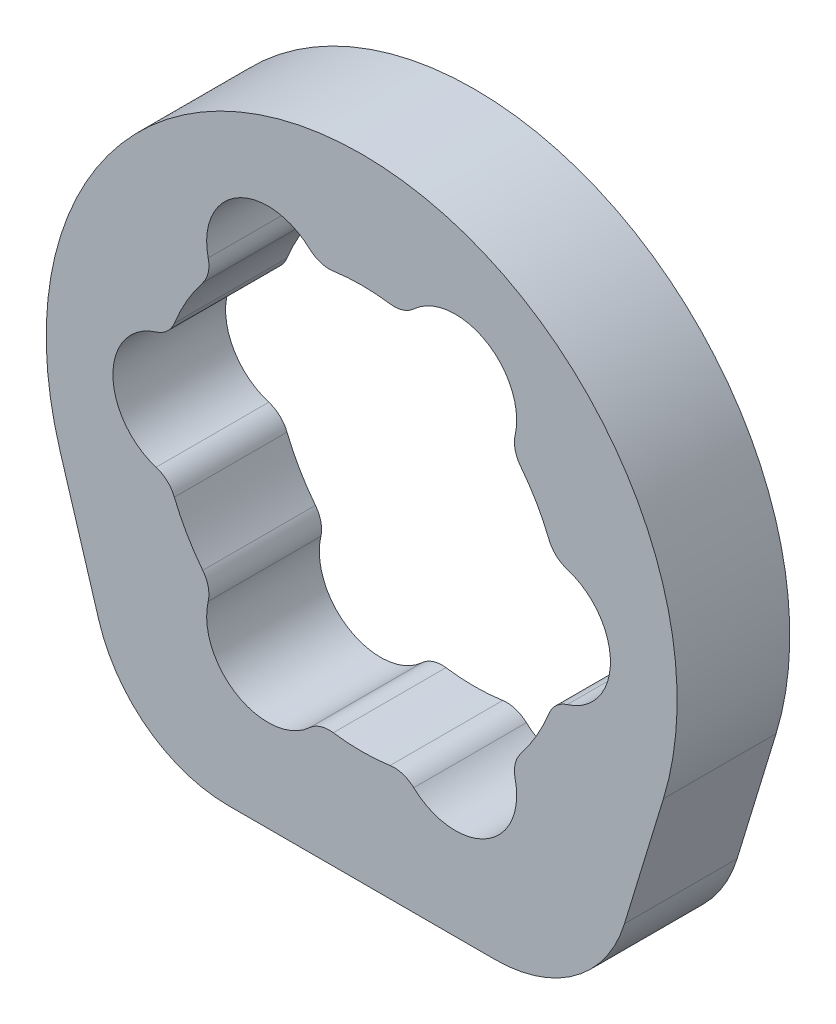
ISO-10303-21;
HEADER;
FILE_DESCRIPTION(('STEP AP214'),'2;1');
FILE_NAME('part.step','',(''),(''),'','','');
FILE_SCHEMA(('AUTOMOTIVE_DESIGN { 1 0 10303 214 1 1 1 1 }'));
ENDSEC;
DATA;
#1=APPLICATION_CONTEXT('core data for automotive mechanical design processes');
#2=APPLICATION_PROTOCOL_DEFINITION('international standard','automotive_design',2000,#1);
#3=PRODUCT_CONTEXT('',#1,'mechanical');
#4=PRODUCT('Part','Part','',(#3));
#5=PRODUCT_RELATED_PRODUCT_CATEGORY('part','',(#4));
#6=PRODUCT_DEFINITION_FORMATION('','',#4);
#7=PRODUCT_DEFINITION_CONTEXT('part definition',#1,'design');
#8=PRODUCT_DEFINITION('design','',#6,#7);
#9=PRODUCT_DEFINITION_SHAPE('','',#8);
#10=(LENGTH_UNIT() NAMED_UNIT(*) SI_UNIT(.MILLI.,.METRE.));
#11=(NAMED_UNIT(*) PLANE_ANGLE_UNIT() SI_UNIT($,.RADIAN.));
#12=(NAMED_UNIT(*) SI_UNIT($,.STERADIAN.) SOLID_ANGLE_UNIT());
#13=UNCERTAINTY_MEASURE_WITH_UNIT(LENGTH_MEASURE(1.E-05),#10,'distance_accuracy_value','');
#14=(GEOMETRIC_REPRESENTATION_CONTEXT(3) GLOBAL_UNCERTAINTY_ASSIGNED_CONTEXT((#13)) GLOBAL_UNIT_ASSIGNED_CONTEXT((#10,
#11,#12)) REPRESENTATION_CONTEXT('',''));
#15=CARTESIAN_POINT('',(0.,0.,0.));
#16=DIRECTION('',(0.,0.,1.));
#17=DIRECTION('',(1.,0.,0.));
#18=AXIS2_PLACEMENT_3D('',#15,#16,#17);
#19=CARTESIAN_POINT('',(0.,0.,3.96875));
#20=DIRECTION('',(0.,0.,-1.));
#21=DIRECTION('',(-1.,0.,0.));
#22=AXIS2_PLACEMENT_3D('',#19,#20,#21);
#23=CYLINDRICAL_SURFACE('',#22,22.225);
#24=CARTESIAN_POINT('',(0.,0.,-3.96875));
#25=DIRECTION('',(0.,0.,1.));
#26=DIRECTION('',(1.,0.,0.));
#27=AXIS2_PLACEMENT_3D('',#24,#25,#26);
#28=CIRCLE('',#27,22.225);
#29=CARTESIAN_POINT('',(21.2586575246007,-6.48229166666667,-3.96875));
#30=VERTEX_POINT('',#29);
#31=CARTESIAN_POINT('',(-21.2586575246007,-6.48229166666667,-3.96875));
#32=VERTEX_POINT('',#31);
#33=EDGE_CURVE('E254',#30,#32,#28,.T.);
#34=ORIENTED_EDGE('',*,*,#33,.T.);
#35=DIRECTION('',(0.,0.,-1.));
#36=VECTOR('',#35,1.);
#37=CARTESIAN_POINT('',(-21.2586575246007,-6.48229166666667,3.96875));
#38=LINE('',#37,#36);
#39=CARTESIAN_POINT('',(-21.2586575246007,-6.48229166666667,3.96875));
#40=VERTEX_POINT('',#39);
#41=EDGE_CURVE('E241',#40,#32,#38,.T.);
#42=ORIENTED_EDGE('',*,*,#41,.F.);
#43=CARTESIAN_POINT('',(0.,0.,3.96875));
#44=DIRECTION('',(0.,0.,1.));
#45=DIRECTION('',(1.,0.,0.));
#46=AXIS2_PLACEMENT_3D('',#43,#44,#45);
#47=CIRCLE('',#46,22.225);
#48=CARTESIAN_POINT('',(21.2586575246007,-6.48229166666667,3.96875));
#49=VERTEX_POINT('',#48);
#50=EDGE_CURVE('E245',#49,#40,#47,.T.);
#51=ORIENTED_EDGE('',*,*,#50,.F.);
#52=DIRECTION('',(0.,0.,-1.));
#53=VECTOR('',#52,1.);
#54=CARTESIAN_POINT('',(21.2586575246007,-6.48229166666667,3.96875));
#55=LINE('',#54,#53);
#56=EDGE_CURVE('E256',#49,#30,#55,.T.);
#57=ORIENTED_EDGE('',*,*,#56,.T.);
#58=EDGE_LOOP('',(#34,#42,#51,#57));
#59=FACE_BOUND('',#58,.T.);
#60=ADVANCED_FACE('F39',(#59),#23,.T.);
#61=CARTESIAN_POINT('',(-21.2586575246007,-6.48229166666666,3.96875));
#62=DIRECTION('',(0.956520023604083,0.291666666666667,0.));
#63=DIRECTION('',(-0.291666666666667,0.956520023604083,0.));
#64=AXIS2_PLACEMENT_3D('',#61,#62,#63);
#65=PLANE('',#64);
#66=DIRECTION('',(0.291666666666667,-0.956520023604083,0.));
#67=VECTOR('',#66,1.);
#68=CARTESIAN_POINT('',(-21.2586575246007,-6.48229166666666,-3.96875));
#69=LINE('',#68,#67);
#70=CARTESIAN_POINT('',(-18.5156049407813,-15.478125,-3.96875));
#71=VERTEX_POINT('',#70);
#72=EDGE_CURVE('E390',#32,#71,#69,.T.);
#73=ORIENTED_EDGE('',*,*,#72,.T.);
#74=DIRECTION('',(0.,0.,-1.));
#75=VECTOR('',#74,1.);
#76=CARTESIAN_POINT('',(-18.5156049407813,-15.478125,3.96875));
#77=LINE('',#76,#75);
#78=CARTESIAN_POINT('',(-18.5156049407813,-15.478125,3.96875));
#79=VERTEX_POINT('',#78);
#80=EDGE_CURVE('E62',#71,#79,#77,.F.);
#81=ORIENTED_EDGE('',*,*,#80,.T.);
#82=DIRECTION('',(0.291666666666667,-0.956520023604083,0.));
#83=VECTOR('',#82,1.);
#84=CARTESIAN_POINT('',(-21.2586575246007,-6.48229166666666,3.96875));
#85=LINE('',#84,#83);
#86=EDGE_CURVE('E237',#40,#79,#85,.T.);
#87=ORIENTED_EDGE('',*,*,#86,.F.);
#88=ORIENTED_EDGE('',*,*,#41,.T.);
#89=EDGE_LOOP('',(#73,#81,#87,#88));
#90=FACE_BOUND('',#89,.T.);
#91=ADVANCED_FACE('F239',(#90),#65,.F.);
#92=CARTESIAN_POINT('',(0.,-22.225,3.96875));
#93=DIRECTION('',(0.,1.,0.));
#94=DIRECTION('',(0.,0.,1.));
#95=AXIS2_PLACEMENT_3D('',#92,#93,#94);
#96=PLANE('',#95);
#97=DIRECTION('',(1.,0.,0.));
#98=VECTOR('',#97,1.);
#99=CARTESIAN_POINT('',(0.,-22.225,3.96875));
#100=LINE('',#99,#98);
#101=CARTESIAN_POINT('',(-9.4047517159524,-22.225,3.96875));
#102=VERTEX_POINT('',#101);
#103=CARTESIAN_POINT('',(9.4047517159524,-22.225,3.96875));
#104=VERTEX_POINT('',#103);
#105=EDGE_CURVE('E244',#102,#104,#100,.T.);
#106=ORIENTED_EDGE('',*,*,#105,.F.);
#107=DIRECTION('',(0.,0.,-1.));
#108=VECTOR('',#107,1.);
#109=CARTESIAN_POINT('',(-9.4047517159524,-22.225,3.96875));
#110=LINE('',#109,#108);
#111=CARTESIAN_POINT('',(-9.4047517159524,-22.225,-3.96875));
#112=VERTEX_POINT('',#111);
#113=EDGE_CURVE('E370',#102,#112,#110,.T.);
#114=ORIENTED_EDGE('',*,*,#113,.T.);
#115=DIRECTION('',(1.,0.,0.));
#116=VECTOR('',#115,1.);
#117=CARTESIAN_POINT('',(0.,-22.225,-3.96875));
#118=LINE('',#117,#116);
#119=CARTESIAN_POINT('',(9.4047517159524,-22.225,-3.96875));
#120=VERTEX_POINT('',#119);
#121=EDGE_CURVE('E391',#112,#120,#118,.T.);
#122=ORIENTED_EDGE('',*,*,#121,.T.);
#123=DIRECTION('',(0.,0.,-1.));
#124=VECTOR('',#123,1.);
#125=CARTESIAN_POINT('',(9.4047517159524,-22.225,3.96875));
#126=LINE('',#125,#124);
#127=EDGE_CURVE('E368',#120,#104,#126,.F.);
#128=ORIENTED_EDGE('',*,*,#127,.T.);
#129=EDGE_LOOP('',(#106,#114,#122,#128));
#130=FACE_BOUND('',#129,.T.);
#131=ADVANCED_FACE('F382',(#130),#96,.F.);
#132=CARTESIAN_POINT('',(-13.208,0.,3.96875));
#133=DIRECTION('',(0.,0.,-1.));
#134=DIRECTION('',(-1.,0.,0.));
#135=AXIS2_PLACEMENT_3D('',#132,#133,#134);
#136=CYLINDRICAL_SURFACE('',#135,4.318);
#137=CARTESIAN_POINT('',(-13.208,0.,3.96875));
#138=DIRECTION('',(0.,0.,1.));
#139=DIRECTION('',(1.,0.,0.));
#140=AXIS2_PLACEMENT_3D('',#137,#138,#139);
#141=CIRCLE('',#140,4.318);
#142=CARTESIAN_POINT('',(-14.48181,4.12583713734557,3.96875));
#143=VERTEX_POINT('',#142);
#144=CARTESIAN_POINT('',(-14.48181,-4.12583713734559,3.96875));
#145=VERTEX_POINT('',#144);
#146=EDGE_CURVE('E399',#143,#145,#141,.T.);
#147=ORIENTED_EDGE('',*,*,#146,.T.);
#148=DIRECTION('',(0.,0.,-1.));
#149=VECTOR('',#148,1.);
#150=CARTESIAN_POINT('',(-14.48181,-4.12583713734559,3.96875));
#151=LINE('',#150,#149);
#152=CARTESIAN_POINT('',(-14.48181,-4.12583713734559,-3.96875));
#153=VERTEX_POINT('',#152);
#154=EDGE_CURVE('E258',#145,#153,#151,.T.);
#155=ORIENTED_EDGE('',*,*,#154,.T.);
#156=CARTESIAN_POINT('',(-13.208,0.,-3.96875));
#157=DIRECTION('',(0.,0.,1.));
#158=DIRECTION('',(1.,0.,0.));
#159=AXIS2_PLACEMENT_3D('',#156,#157,#158);
#160=CIRCLE('',#159,4.318);
#161=CARTESIAN_POINT('',(-14.48181,4.12583713734557,-3.96875));
#162=VERTEX_POINT('',#161);
#163=EDGE_CURVE('E431',#162,#153,#160,.T.);
#164=ORIENTED_EDGE('',*,*,#163,.F.);
#165=DIRECTION('',(0.,0.,-1.));
#166=VECTOR('',#165,1.);
#167=CARTESIAN_POINT('',(-14.48181,4.12583713734557,3.96875));
#168=LINE('',#167,#166);
#169=EDGE_CURVE('E255',#162,#143,#168,.F.);
#170=ORIENTED_EDGE('',*,*,#169,.T.);
#171=EDGE_LOOP('',(#147,#155,#164,#170));
#172=FACE_BOUND('',#171,.T.);
#173=ADVANCED_FACE('F551',(#172),#136,.F.);
#174=CARTESIAN_POINT('',(0.,0.,3.96875));
#175=DIRECTION('',(0.,0.,-1.));
#176=DIRECTION('',(-1.,0.,0.));
#177=AXIS2_PLACEMENT_3D('',#174,#175,#176);
#178=CYLINDRICAL_SURFACE('',#177,14.224);
#179=CARTESIAN_POINT('',(0.,0.,-3.96875));
#180=DIRECTION('',(0.,0.,1.));
#181=DIRECTION('',(1.,0.,0.));
#182=AXIS2_PLACEMENT_3D('',#179,#180,#181);
#183=CIRCLE('',#182,14.224);
#184=CARTESIAN_POINT('',(-11.195759817965,8.77366161294357,-3.96875));
#185=VERTEX_POINT('',#184);
#186=CARTESIAN_POINT('',(-13.19609375,5.30898161055497,-3.96875));
#187=VERTEX_POINT('',#186);
#188=EDGE_CURVE('E434',#185,#187,#183,.T.);
#189=ORIENTED_EDGE('',*,*,#188,.F.);
#190=DIRECTION('',(0.,0.,-1.));
#191=VECTOR('',#190,1.);
#192=CARTESIAN_POINT('',(-11.195759817965,8.77366161294357,3.96875));
#193=LINE('',#192,#191);
#194=CARTESIAN_POINT('',(-11.195759817965,8.77366161294357,3.96875));
#195=VERTEX_POINT('',#194);
#196=EDGE_CURVE('E366',#185,#195,#193,.F.);
#197=ORIENTED_EDGE('',*,*,#196,.T.);
#198=CARTESIAN_POINT('',(0.,0.,3.96875));
#199=DIRECTION('',(0.,0.,1.));
#200=DIRECTION('',(1.,0.,0.));
#201=AXIS2_PLACEMENT_3D('',#198,#199,#200);
#202=CIRCLE('',#201,14.224);
#203=CARTESIAN_POINT('',(-13.19609375,5.30898161055497,3.96875));
#204=VERTEX_POINT('',#203);
#205=EDGE_CURVE('E402',#195,#204,#202,.T.);
#206=ORIENTED_EDGE('',*,*,#205,.T.);
#207=DIRECTION('',(0.,0.,-1.));
#208=VECTOR('',#207,1.);
#209=CARTESIAN_POINT('',(-13.19609375,5.30898161055497,3.96875));
#210=LINE('',#209,#208);
#211=EDGE_CURVE('E363',#204,#187,#210,.T.);
#212=ORIENTED_EDGE('',*,*,#211,.T.);
#213=EDGE_LOOP('',(#189,#197,#206,#212));
#214=FACE_BOUND('',#213,.T.);
#215=ADVANCED_FACE('F534',(#214),#178,.F.);
#216=CARTESIAN_POINT('',(-6.604,11.4384635331849,3.96875));
#217=DIRECTION('',(0.,0.,-1.));
#218=DIRECTION('',(-1.,0.,0.));
#219=AXIS2_PLACEMENT_3D('',#216,#217,#218);
#220=CYLINDRICAL_SURFACE('',#219,4.318);
#221=CARTESIAN_POINT('',(-6.604,11.4384635331849,3.96875));
#222=DIRECTION('',(0.,0.,1.));
#223=DIRECTION('',(1.,0.,0.));
#224=AXIS2_PLACEMENT_3D('',#221,#222,#223);
#225=CIRCLE('',#224,4.318);
#226=CARTESIAN_POINT('',(-3.66782522718146,14.6045339214523,3.96875));
#227=VERTEX_POINT('',#226);
#228=CARTESIAN_POINT('',(-10.8139847728185,10.4786967841067,3.96875));
#229=VERTEX_POINT('',#228);
#230=EDGE_CURVE('E408',#227,#229,#225,.T.);
#231=ORIENTED_EDGE('',*,*,#230,.T.);
#232=DIRECTION('',(0.,0.,-1.));
#233=VECTOR('',#232,1.);
#234=CARTESIAN_POINT('',(-10.8139847728185,10.4786967841067,3.96875));
#235=LINE('',#234,#233);
#236=CARTESIAN_POINT('',(-10.8139847728185,10.4786967841067,-3.96875));
#237=VERTEX_POINT('',#236);
#238=EDGE_CURVE('E360',#229,#237,#235,.T.);
#239=ORIENTED_EDGE('',*,*,#238,.T.);
#240=CARTESIAN_POINT('',(-6.604,11.4384635331849,-3.96875));
#241=DIRECTION('',(0.,0.,1.));
#242=DIRECTION('',(1.,0.,0.));
#243=AXIS2_PLACEMENT_3D('',#240,#241,#242);
#244=CIRCLE('',#243,4.318);
#245=CARTESIAN_POINT('',(-3.66782522718146,14.6045339214523,-3.96875));
#246=VERTEX_POINT('',#245);
#247=EDGE_CURVE('E437',#246,#237,#244,.T.);
#248=ORIENTED_EDGE('',*,*,#247,.F.);
#249=DIRECTION('',(0.,0.,-1.));
#250=VECTOR('',#249,1.);
#251=CARTESIAN_POINT('',(-3.66782522718146,14.6045339214523,3.96875));
#252=LINE('',#251,#250);
#253=EDGE_CURVE('E358',#246,#227,#252,.F.);
#254=ORIENTED_EDGE('',*,*,#253,.T.);
#255=EDGE_LOOP('',(#231,#239,#248,#254));
#256=FACE_BOUND('',#255,.T.);
#257=ADVANCED_FACE('F547',(#256),#220,.F.);
#258=CARTESIAN_POINT('',(2.00033393203496,14.0826432234985,-3.96875));
#259=VERTEX_POINT('',#258);
#260=CARTESIAN_POINT('',(-2.00033393203496,14.0826432234985,-3.96875));
#261=VERTEX_POINT('',#260);
#262=EDGE_CURVE('E438',#259,#261,#183,.T.);
#263=ORIENTED_EDGE('',*,*,#262,.F.);
#264=DIRECTION('',(0.,0.,-1.));
#265=VECTOR('',#264,1.);
#266=CARTESIAN_POINT('',(2.00033393203496,14.0826432234985,3.96875));
#267=LINE('',#266,#265);
#268=CARTESIAN_POINT('',(2.00033393203496,14.0826432234985,3.96875));
#269=VERTEX_POINT('',#268);
#270=EDGE_CURVE('E356',#259,#269,#267,.F.);
#271=ORIENTED_EDGE('',*,*,#270,.T.);
#272=CARTESIAN_POINT('',(-2.00033393203496,14.0826432234985,3.96875));
#273=VERTEX_POINT('',#272);
#274=EDGE_CURVE('E410',#269,#273,#202,.T.);
#275=ORIENTED_EDGE('',*,*,#274,.T.);
#276=DIRECTION('',(0.,0.,-1.));
#277=VECTOR('',#276,1.);
#278=CARTESIAN_POINT('',(-2.00033393203496,14.0826432234986,3.96875));
#279=LINE('',#278,#277);
#280=EDGE_CURVE('E353',#273,#261,#279,.T.);
#281=ORIENTED_EDGE('',*,*,#280,.T.);
#282=EDGE_LOOP('',(#263,#271,#275,#281));
#283=FACE_BOUND('',#282,.T.);
#284=ADVANCED_FACE('F468',(#283),#178,.F.);
#285=CARTESIAN_POINT('',(6.604,11.4384635331849,3.96875));
#286=DIRECTION('',(0.,0.,-1.));
#287=DIRECTION('',(-1.,0.,0.));
#288=AXIS2_PLACEMENT_3D('',#285,#286,#287);
#289=CYLINDRICAL_SURFACE('',#288,4.318);
#290=CARTESIAN_POINT('',(6.604,11.4384635331849,-3.96875));
#291=DIRECTION('',(0.,0.,1.));
#292=DIRECTION('',(1.,0.,0.));
#293=AXIS2_PLACEMENT_3D('',#290,#291,#292);
#294=CIRCLE('',#293,4.318);
#295=CARTESIAN_POINT('',(10.8139847728185,10.4786967841067,-3.96875));
#296=VERTEX_POINT('',#295);
#297=CARTESIAN_POINT('',(3.66782522718146,14.6045339214523,-3.96875));
#298=VERTEX_POINT('',#297);
#299=EDGE_CURVE('E441',#296,#298,#294,.T.);
#300=ORIENTED_EDGE('',*,*,#299,.F.);
#301=DIRECTION('',(0.,0.,-1.));
#302=VECTOR('',#301,1.);
#303=CARTESIAN_POINT('',(10.8139847728185,10.4786967841067,3.96875));
#304=LINE('',#303,#302);
#305=CARTESIAN_POINT('',(10.8139847728185,10.4786967841067,3.96875));
#306=VERTEX_POINT('',#305);
#307=EDGE_CURVE('E351',#296,#306,#304,.F.);
#308=ORIENTED_EDGE('',*,*,#307,.T.);
#309=CARTESIAN_POINT('',(6.604,11.4384635331849,3.96875));
#310=DIRECTION('',(0.,0.,1.));
#311=DIRECTION('',(1.,0.,0.));
#312=AXIS2_PLACEMENT_3D('',#309,#310,#311);
#313=CIRCLE('',#312,4.318);
#314=CARTESIAN_POINT('',(3.66782522718146,14.6045339214523,3.96875));
#315=VERTEX_POINT('',#314);
#316=EDGE_CURVE('E419',#306,#315,#313,.T.);
#317=ORIENTED_EDGE('',*,*,#316,.T.);
#318=DIRECTION('',(0.,0.,-1.));
#319=VECTOR('',#318,1.);
#320=CARTESIAN_POINT('',(3.66782522718146,14.6045339214523,3.96875));
#321=LINE('',#320,#319);
#322=EDGE_CURVE('E348',#315,#298,#321,.T.);
#323=ORIENTED_EDGE('',*,*,#322,.T.);
#324=EDGE_LOOP('',(#300,#308,#317,#323));
#325=FACE_BOUND('',#324,.T.);
#326=ADVANCED_FACE('F482',(#325),#289,.F.);
#327=CARTESIAN_POINT('',(13.19609375,5.30898161055498,-3.96875));
#328=VERTEX_POINT('',#327);
#329=CARTESIAN_POINT('',(11.195759817965,8.77366161294357,-3.96875));
#330=VERTEX_POINT('',#329);
#331=EDGE_CURVE('E444',#328,#330,#183,.T.);
#332=ORIENTED_EDGE('',*,*,#331,.F.);
#333=DIRECTION('',(0.,0.,-1.));
#334=VECTOR('',#333,1.);
#335=CARTESIAN_POINT('',(13.19609375,5.30898161055498,3.96875));
#336=LINE('',#335,#334);
#337=CARTESIAN_POINT('',(13.19609375,5.30898161055498,3.96875));
#338=VERTEX_POINT('',#337);
#339=EDGE_CURVE('E346',#328,#338,#336,.F.);
#340=ORIENTED_EDGE('',*,*,#339,.T.);
#341=CARTESIAN_POINT('',(11.195759817965,8.77366161294357,3.96875));
#342=VERTEX_POINT('',#341);
#343=EDGE_CURVE('E422',#338,#342,#202,.T.);
#344=ORIENTED_EDGE('',*,*,#343,.T.);
#345=DIRECTION('',(0.,0.,-1.));
#346=VECTOR('',#345,1.);
#347=CARTESIAN_POINT('',(11.195759817965,8.77366161294357,3.96875));
#348=LINE('',#347,#346);
#349=EDGE_CURVE('E343',#342,#330,#348,.T.);
#350=ORIENTED_EDGE('',*,*,#349,.T.);
#351=EDGE_LOOP('',(#332,#340,#344,#350));
#352=FACE_BOUND('',#351,.T.);
#353=ADVANCED_FACE('F491',(#352),#178,.F.);
#354=CARTESIAN_POINT('',(13.208,0.,3.96875));
#355=DIRECTION('',(0.,0.,-1.));
#356=DIRECTION('',(-1.,0.,0.));
#357=AXIS2_PLACEMENT_3D('',#354,#355,#356);
#358=CYLINDRICAL_SURFACE('',#357,4.318);
#359=CARTESIAN_POINT('',(13.208,0.,-3.96875));
#360=DIRECTION('',(0.,0.,1.));
#361=DIRECTION('',(1.,0.,0.));
#362=AXIS2_PLACEMENT_3D('',#359,#360,#361);
#363=CIRCLE('',#362,4.318);
#364=CARTESIAN_POINT('',(14.48181,-4.12583713734558,-3.96875));
#365=VERTEX_POINT('',#364);
#366=CARTESIAN_POINT('',(14.48181,4.12583713734558,-3.96875));
#367=VERTEX_POINT('',#366);
#368=EDGE_CURVE('E445',#365,#367,#363,.T.);
#369=ORIENTED_EDGE('',*,*,#368,.F.);
#370=DIRECTION('',(0.,0.,-1.));
#371=VECTOR('',#370,1.);
#372=CARTESIAN_POINT('',(14.48181,-4.12583713734558,3.96875));
#373=LINE('',#372,#371);
#374=CARTESIAN_POINT('',(14.48181,-4.12583713734558,3.96875));
#375=VERTEX_POINT('',#374);
#376=EDGE_CURVE('E341',#365,#375,#373,.F.);
#377=ORIENTED_EDGE('',*,*,#376,.T.);
#378=CARTESIAN_POINT('',(13.208,0.,3.96875));
#379=DIRECTION('',(0.,0.,1.));
#380=DIRECTION('',(1.,0.,0.));
#381=AXIS2_PLACEMENT_3D('',#378,#379,#380);
#382=CIRCLE('',#381,4.318);
#383=CARTESIAN_POINT('',(14.48181,4.12583713734558,3.96875));
#384=VERTEX_POINT('',#383);
#385=EDGE_CURVE('E423',#375,#384,#382,.T.);
#386=ORIENTED_EDGE('',*,*,#385,.T.);
#387=DIRECTION('',(0.,0.,-1.));
#388=VECTOR('',#387,1.);
#389=CARTESIAN_POINT('',(14.48181,4.12583713734558,3.96875));
#390=LINE('',#389,#388);
#391=EDGE_CURVE('E338',#384,#367,#390,.T.);
#392=ORIENTED_EDGE('',*,*,#391,.T.);
#393=EDGE_LOOP('',(#369,#377,#386,#392));
#394=FACE_BOUND('',#393,.T.);
#395=ADVANCED_FACE('F506',(#394),#358,.F.);
#396=CARTESIAN_POINT('',(11.195759817965,-8.77366161294357,-3.96875));
#397=VERTEX_POINT('',#396);
#398=CARTESIAN_POINT('',(13.19609375,-5.30898161055498,-3.96875));
#399=VERTEX_POINT('',#398);
#400=EDGE_CURVE('E448',#397,#399,#183,.T.);
#401=ORIENTED_EDGE('',*,*,#400,.F.);
#402=DIRECTION('',(0.,0.,-1.));
#403=VECTOR('',#402,1.);
#404=CARTESIAN_POINT('',(11.195759817965,-8.77366161294357,3.96875));
#405=LINE('',#404,#403);
#406=CARTESIAN_POINT('',(11.195759817965,-8.77366161294357,3.96875));
#407=VERTEX_POINT('',#406);
#408=EDGE_CURVE('E336',#397,#407,#405,.F.);
#409=ORIENTED_EDGE('',*,*,#408,.T.);
#410=CARTESIAN_POINT('',(13.19609375,-5.30898161055498,3.96875));
#411=VERTEX_POINT('',#410);
#412=EDGE_CURVE('E416',#407,#411,#202,.T.);
#413=ORIENTED_EDGE('',*,*,#412,.T.);
#414=DIRECTION('',(0.,0.,-1.));
#415=VECTOR('',#414,1.);
#416=CARTESIAN_POINT('',(13.19609375,-5.30898161055498,3.96875));
#417=LINE('',#416,#415);
#418=EDGE_CURVE('E333',#411,#399,#417,.T.);
#419=ORIENTED_EDGE('',*,*,#418,.T.);
#420=EDGE_LOOP('',(#401,#409,#413,#419));
#421=FACE_BOUND('',#420,.T.);
#422=ADVANCED_FACE('F497',(#421),#178,.F.);
#423=CARTESIAN_POINT('',(6.604,-11.4384635331849,3.96875));
#424=DIRECTION('',(0.,0.,-1.));
#425=DIRECTION('',(-1.,0.,0.));
#426=AXIS2_PLACEMENT_3D('',#423,#424,#425);
#427=CYLINDRICAL_SURFACE('',#426,4.318);
#428=CARTESIAN_POINT('',(6.604,-11.4384635331849,-3.96875));
#429=DIRECTION('',(0.,0.,1.));
#430=DIRECTION('',(1.,0.,0.));
#431=AXIS2_PLACEMENT_3D('',#428,#429,#430);
#432=CIRCLE('',#431,4.318);
#433=CARTESIAN_POINT('',(3.66782522718145,-14.6045339214523,-3.96875));
#434=VERTEX_POINT('',#433);
#435=CARTESIAN_POINT('',(10.8139847728185,-10.4786967841067,-3.96875));
#436=VERTEX_POINT('',#435);
#437=EDGE_CURVE('E449',#434,#436,#432,.T.);
#438=ORIENTED_EDGE('',*,*,#437,.F.);
#439=DIRECTION('',(0.,0.,-1.));
#440=VECTOR('',#439,1.);
#441=CARTESIAN_POINT('',(3.66782522718145,-14.6045339214523,3.96875));
#442=LINE('',#441,#440);
#443=CARTESIAN_POINT('',(3.66782522718145,-14.6045339214523,3.96875));
#444=VERTEX_POINT('',#443);
#445=EDGE_CURVE('E331',#434,#444,#442,.F.);
#446=ORIENTED_EDGE('',*,*,#445,.T.);
#447=CARTESIAN_POINT('',(6.604,-11.4384635331849,3.96875));
#448=DIRECTION('',(0.,0.,1.));
#449=DIRECTION('',(1.,0.,0.));
#450=AXIS2_PLACEMENT_3D('',#447,#448,#449);
#451=CIRCLE('',#450,4.318);
#452=CARTESIAN_POINT('',(10.8139847728185,-10.4786967841067,3.96875));
#453=VERTEX_POINT('',#452);
#454=EDGE_CURVE('E415',#444,#453,#451,.T.);
#455=ORIENTED_EDGE('',*,*,#454,.T.);
#456=DIRECTION('',(0.,0.,-1.));
#457=VECTOR('',#456,1.);
#458=CARTESIAN_POINT('',(10.8139847728185,-10.4786967841067,3.96875));
#459=LINE('',#458,#457);
#460=EDGE_CURVE('E328',#453,#436,#459,.T.);
#461=ORIENTED_EDGE('',*,*,#460,.T.);
#462=EDGE_LOOP('',(#438,#446,#455,#461));
#463=FACE_BOUND('',#462,.T.);
#464=ADVANCED_FACE('F539',(#463),#427,.F.);
#465=CARTESIAN_POINT('',(-2.00033393203496,-14.0826432234985,-3.96875));
#466=VERTEX_POINT('',#465);
#467=CARTESIAN_POINT('',(2.00033393203496,-14.0826432234985,-3.96875));
#468=VERTEX_POINT('',#467);
#469=EDGE_CURVE('E451',#466,#468,#183,.T.);
#470=ORIENTED_EDGE('',*,*,#469,.F.);
#471=DIRECTION('',(0.,0.,-1.));
#472=VECTOR('',#471,1.);
#473=CARTESIAN_POINT('',(-2.00033393203496,-14.0826432234986,3.96875));
#474=LINE('',#473,#472);
#475=CARTESIAN_POINT('',(-2.00033393203496,-14.0826432234985,3.96875));
#476=VERTEX_POINT('',#475);
#477=EDGE_CURVE('E326',#466,#476,#474,.F.);
#478=ORIENTED_EDGE('',*,*,#477,.T.);
#479=CARTESIAN_POINT('',(2.00033393203496,-14.0826432234985,3.96875));
#480=VERTEX_POINT('',#479);
#481=EDGE_CURVE('E411',#476,#480,#202,.T.);
#482=ORIENTED_EDGE('',*,*,#481,.T.);
#483=DIRECTION('',(0.,0.,-1.));
#484=VECTOR('',#483,1.);
#485=CARTESIAN_POINT('',(2.00033393203496,-14.0826432234985,3.96875));
#486=LINE('',#485,#484);
#487=EDGE_CURVE('E323',#480,#468,#486,.T.);
#488=ORIENTED_EDGE('',*,*,#487,.T.);
#489=EDGE_LOOP('',(#470,#478,#482,#488));
#490=FACE_BOUND('',#489,.T.);
#491=ADVANCED_FACE('F535',(#490),#178,.F.);
#492=CARTESIAN_POINT('',(-6.604,-11.4384635331849,3.96875));
#493=DIRECTION('',(0.,0.,-1.));
#494=DIRECTION('',(-1.,0.,0.));
#495=AXIS2_PLACEMENT_3D('',#492,#493,#494);
#496=CYLINDRICAL_SURFACE('',#495,4.318);
#497=CARTESIAN_POINT('',(-6.604,-11.4384635331849,-3.96875));
#498=DIRECTION('',(0.,0.,1.));
#499=DIRECTION('',(1.,0.,0.));
#500=AXIS2_PLACEMENT_3D('',#497,#498,#499);
#501=CIRCLE('',#500,4.318);
#502=CARTESIAN_POINT('',(-10.8139847728185,-10.4786967841067,-3.96875));
#503=VERTEX_POINT('',#502);
#504=CARTESIAN_POINT('',(-3.66782522718146,-14.6045339214523,-3.96875));
#505=VERTEX_POINT('',#504);
#506=EDGE_CURVE('E452',#503,#505,#501,.T.);
#507=ORIENTED_EDGE('',*,*,#506,.F.);
#508=DIRECTION('',(0.,0.,-1.));
#509=VECTOR('',#508,1.);
#510=CARTESIAN_POINT('',(-10.8139847728185,-10.4786967841067,3.96875));
#511=LINE('',#510,#509);
#512=CARTESIAN_POINT('',(-10.8139847728185,-10.4786967841067,3.96875));
#513=VERTEX_POINT('',#512);
#514=EDGE_CURVE('E321',#503,#513,#511,.F.);
#515=ORIENTED_EDGE('',*,*,#514,.T.);
#516=CARTESIAN_POINT('',(-6.604,-11.4384635331849,3.96875));
#517=DIRECTION('',(0.,0.,1.));
#518=DIRECTION('',(1.,0.,0.));
#519=AXIS2_PLACEMENT_3D('',#516,#517,#518);
#520=CIRCLE('',#519,4.318);
#521=CARTESIAN_POINT('',(-3.66782522718146,-14.6045339214523,3.96875));
#522=VERTEX_POINT('',#521);
#523=EDGE_CURVE('E414',#513,#522,#520,.T.);
#524=ORIENTED_EDGE('',*,*,#523,.T.);
#525=DIRECTION('',(0.,0.,-1.));
#526=VECTOR('',#525,1.);
#527=CARTESIAN_POINT('',(-3.66782522718146,-14.6045339214523,3.96875));
#528=LINE('',#527,#526);
#529=EDGE_CURVE('E318',#522,#505,#528,.T.);
#530=ORIENTED_EDGE('',*,*,#529,.T.);
#531=EDGE_LOOP('',(#507,#515,#524,#530));
#532=FACE_BOUND('',#531,.T.);
#533=ADVANCED_FACE('F532',(#532),#496,.F.);
#534=CARTESIAN_POINT('',(-13.19609375,-5.30898161055499,-3.96875));
#535=VERTEX_POINT('',#534);
#536=CARTESIAN_POINT('',(-11.195759817965,-8.77366161294357,-3.96875));
#537=VERTEX_POINT('',#536);
#538=EDGE_CURVE('E395',#535,#537,#183,.T.);
#539=ORIENTED_EDGE('',*,*,#538,.F.);
#540=DIRECTION('',(0.,0.,-1.));
#541=VECTOR('',#540,1.);
#542=CARTESIAN_POINT('',(-13.19609375,-5.30898161055499,3.96875));
#543=LINE('',#542,#541);
#544=CARTESIAN_POINT('',(-13.19609375,-5.30898161055499,3.96875));
#545=VERTEX_POINT('',#544);
#546=EDGE_CURVE('E292',#535,#545,#543,.F.);
#547=ORIENTED_EDGE('',*,*,#546,.T.);
#548=CARTESIAN_POINT('',(-11.195759817965,-8.77366161294357,3.96875));
#549=VERTEX_POINT('',#548);
#550=EDGE_CURVE('E251',#545,#549,#202,.T.);
#551=ORIENTED_EDGE('',*,*,#550,.T.);
#552=DIRECTION('',(0.,0.,-1.));
#553=VECTOR('',#552,1.);
#554=CARTESIAN_POINT('',(-11.195759817965,-8.77366161294357,3.96875));
#555=LINE('',#554,#553);
#556=EDGE_CURVE('E289',#549,#537,#555,.T.);
#557=ORIENTED_EDGE('',*,*,#556,.T.);
#558=EDGE_LOOP('',(#539,#547,#551,#557));
#559=FACE_BOUND('',#558,.T.);
#560=ADVANCED_FACE('F528',(#559),#178,.F.);
#561=CARTESIAN_POINT('',(21.2586575246007,-6.48229166666667,3.96875));
#562=DIRECTION('',(0.956520023604083,-0.291666666666667,0.));
#563=DIRECTION('',(0.291666666666667,0.956520023604083,0.));
#564=AXIS2_PLACEMENT_3D('',#561,#562,#563);
#565=PLANE('',#564);
#566=DIRECTION('',(-0.291666666666667,-0.956520023604083,0.));
#567=VECTOR('',#566,1.);
#568=CARTESIAN_POINT('',(21.2586575246007,-6.48229166666667,3.96875));
#569=LINE('',#568,#567);
#570=CARTESIAN_POINT('',(18.5156049407813,-15.478125,3.96875));
#571=VERTEX_POINT('',#570);
#572=EDGE_CURVE('E249',#49,#571,#569,.T.);
#573=ORIENTED_EDGE('',*,*,#572,.T.);
#574=DIRECTION('',(0.,0.,-1.));
#575=VECTOR('',#574,1.);
#576=CARTESIAN_POINT('',(18.5156049407813,-15.478125,-3.96875));
#577=LINE('',#576,#575);
#578=CARTESIAN_POINT('',(18.5156049407813,-15.478125,-3.96875));
#579=VERTEX_POINT('',#578);
#580=EDGE_CURVE('E11',#571,#579,#577,.T.);
#581=ORIENTED_EDGE('',*,*,#580,.T.);
#582=DIRECTION('',(-0.291666666666667,-0.956520023604083,0.));
#583=VECTOR('',#582,1.);
#584=CARTESIAN_POINT('',(21.2586575246007,-6.48229166666667,-3.96875));
#585=LINE('',#584,#583);
#586=EDGE_CURVE('E393',#30,#579,#585,.T.);
#587=ORIENTED_EDGE('',*,*,#586,.F.);
#588=ORIENTED_EDGE('',*,*,#56,.F.);
#589=EDGE_LOOP('',(#573,#581,#587,#588));
#590=FACE_BOUND('',#589,.T.);
#591=ADVANCED_FACE('F531',(#590),#565,.T.);
#592=CARTESIAN_POINT('',(0.,0.,3.96875));
#593=DIRECTION('',(0.,0.,1.));
#594=DIRECTION('',(1.,0.,0.));
#595=AXIS2_PLACEMENT_3D('',#592,#593,#594);
#596=PLANE('',#595);
#597=ORIENTED_EDGE('',*,*,#550,.F.);
#598=CARTESIAN_POINT('',(-15.08125,-6.06740755491998,3.96875));
#599=DIRECTION('',(0.,0.,1.));
#600=DIRECTION('',(1.,0.,0.));
#601=AXIS2_PLACEMENT_3D('',#598,#599,#600);
#602=CIRCLE('',#601,2.032);
#603=EDGE_CURVE('E316',#545,#145,#602,.T.);
#604=ORIENTED_EDGE('',*,*,#603,.T.);
#605=ORIENTED_EDGE('',*,*,#146,.F.);
#606=CARTESIAN_POINT('',(-15.08125,6.06740755491996,3.96875));
#607=DIRECTION('',(0.,0.,1.));
#608=DIRECTION('',(1.,0.,0.));
#609=AXIS2_PLACEMENT_3D('',#606,#607,#608);
#610=CIRCLE('',#609,2.032);
#611=EDGE_CURVE('E296',#143,#204,#610,.T.);
#612=ORIENTED_EDGE('',*,*,#611,.T.);
#613=ORIENTED_EDGE('',*,*,#205,.F.);
#614=CARTESIAN_POINT('',(-12.7951540776743,10.0270418433641,3.96875));
#615=DIRECTION('',(0.,0.,1.));
#616=DIRECTION('',(1.,0.,0.));
#617=AXIS2_PLACEMENT_3D('',#614,#615,#616);
#618=CIRCLE('',#617,2.032);
#619=EDGE_CURVE('E298',#195,#229,#618,.T.);
#620=ORIENTED_EDGE('',*,*,#619,.T.);
#621=ORIENTED_EDGE('',*,*,#230,.F.);
#622=CARTESIAN_POINT('',(-2.28609592232567,16.0944493982841,3.96875));
#623=DIRECTION('',(0.,0.,1.));
#624=DIRECTION('',(1.,0.,0.));
#625=AXIS2_PLACEMENT_3D('',#622,#623,#624);
#626=CIRCLE('',#625,2.032);
#627=EDGE_CURVE('E294',#227,#273,#626,.T.);
#628=ORIENTED_EDGE('',*,*,#627,.T.);
#629=ORIENTED_EDGE('',*,*,#274,.F.);
#630=CARTESIAN_POINT('',(2.28609592232567,16.0944493982841,3.96875));
#631=DIRECTION('',(0.,0.,1.));
#632=DIRECTION('',(1.,0.,0.));
#633=AXIS2_PLACEMENT_3D('',#630,#631,#632);
#634=CIRCLE('',#633,2.032);
#635=EDGE_CURVE('E300',#269,#315,#634,.T.);
#636=ORIENTED_EDGE('',*,*,#635,.T.);
#637=ORIENTED_EDGE('',*,*,#316,.F.);
#638=CARTESIAN_POINT('',(12.7951540776743,10.0270418433641,3.96875));
#639=DIRECTION('',(0.,0.,1.));
#640=DIRECTION('',(1.,0.,0.));
#641=AXIS2_PLACEMENT_3D('',#638,#639,#640);
#642=CIRCLE('',#641,2.032);
#643=EDGE_CURVE('E302',#306,#342,#642,.T.);
#644=ORIENTED_EDGE('',*,*,#643,.T.);
#645=ORIENTED_EDGE('',*,*,#343,.F.);
#646=CARTESIAN_POINT('',(15.08125,6.06740755491997,3.96875));
#647=DIRECTION('',(0.,0.,1.));
#648=DIRECTION('',(1.,0.,0.));
#649=AXIS2_PLACEMENT_3D('',#646,#647,#648);
#650=CIRCLE('',#649,2.032);
#651=EDGE_CURVE('E304',#338,#384,#650,.T.);
#652=ORIENTED_EDGE('',*,*,#651,.T.);
#653=ORIENTED_EDGE('',*,*,#385,.F.);
#654=CARTESIAN_POINT('',(15.08125,-6.06740755491997,3.96875));
#655=DIRECTION('',(0.,0.,1.));
#656=DIRECTION('',(1.,0.,0.));
#657=AXIS2_PLACEMENT_3D('',#654,#655,#656);
#658=CIRCLE('',#657,2.032);
#659=EDGE_CURVE('E306',#375,#411,#658,.T.);
#660=ORIENTED_EDGE('',*,*,#659,.T.);
#661=ORIENTED_EDGE('',*,*,#412,.F.);
#662=CARTESIAN_POINT('',(12.7951540776743,-10.0270418433641,3.96875));
#663=DIRECTION('',(0.,0.,1.));
#664=DIRECTION('',(1.,0.,0.));
#665=AXIS2_PLACEMENT_3D('',#662,#663,#664);
#666=CIRCLE('',#665,2.032);
#667=EDGE_CURVE('E308',#407,#453,#666,.T.);
#668=ORIENTED_EDGE('',*,*,#667,.T.);
#669=ORIENTED_EDGE('',*,*,#454,.F.);
#670=CARTESIAN_POINT('',(2.28609592232567,-16.0944493982841,3.96875));
#671=DIRECTION('',(0.,0.,1.));
#672=DIRECTION('',(1.,0.,0.));
#673=AXIS2_PLACEMENT_3D('',#670,#671,#672);
#674=CIRCLE('',#673,2.032);
#675=EDGE_CURVE('E310',#444,#480,#674,.T.);
#676=ORIENTED_EDGE('',*,*,#675,.T.);
#677=ORIENTED_EDGE('',*,*,#481,.F.);
#678=CARTESIAN_POINT('',(-2.28609592232567,-16.0944493982841,3.96875));
#679=DIRECTION('',(0.,0.,1.));
#680=DIRECTION('',(1.,0.,0.));
#681=AXIS2_PLACEMENT_3D('',#678,#679,#680);
#682=CIRCLE('',#681,2.032);
#683=EDGE_CURVE('E312',#476,#522,#682,.T.);
#684=ORIENTED_EDGE('',*,*,#683,.T.);
#685=ORIENTED_EDGE('',*,*,#523,.F.);
#686=CARTESIAN_POINT('',(-12.7951540776743,-10.0270418433641,3.96875));
#687=DIRECTION('',(0.,0.,1.));
#688=DIRECTION('',(1.,0.,0.));
#689=AXIS2_PLACEMENT_3D('',#686,#687,#688);
#690=CIRCLE('',#689,2.032);
#691=EDGE_CURVE('E314',#513,#549,#690,.T.);
#692=ORIENTED_EDGE('',*,*,#691,.T.);
#693=EDGE_LOOP('',(#597,#604,#605,#612,#613,#620,#621,#628,#629,#636,#637,#644,#645,#652,#653,
#660,#661,#668,#669,#676,#677,#684,#685,#692));
#694=FACE_BOUND('',#693,.T.);
#695=ORIENTED_EDGE('',*,*,#86,.T.);
#696=CARTESIAN_POINT('',(-9.4047517159524,-12.7,3.96875));
#697=DIRECTION('',(0.,0.,1.));
#698=DIRECTION('',(1.,0.,0.));
#699=AXIS2_PLACEMENT_3D('',#696,#697,#698);
#700=CIRCLE('',#699,9.525);
#701=EDGE_CURVE('E47',#79,#102,#700,.T.);
#702=ORIENTED_EDGE('',*,*,#701,.T.);
#703=ORIENTED_EDGE('',*,*,#105,.T.);
#704=CARTESIAN_POINT('',(9.4047517159524,-12.7,3.96875));
#705=DIRECTION('',(0.,0.,1.));
#706=DIRECTION('',(1.,0.,0.));
#707=AXIS2_PLACEMENT_3D('',#704,#705,#706);
#708=CIRCLE('',#707,9.525);
#709=EDGE_CURVE('E54',#104,#571,#708,.T.);
#710=ORIENTED_EDGE('',*,*,#709,.T.);
#711=ORIENTED_EDGE('',*,*,#572,.F.);
#712=ORIENTED_EDGE('',*,*,#50,.T.);
#713=EDGE_LOOP('',(#695,#702,#703,#710,#711,#712));
#714=FACE_BOUND('',#713,.T.);
#715=ADVANCED_FACE('F248',(#694,#714),#596,.T.);
#716=CARTESIAN_POINT('',(0.,0.,-3.96875));
#717=DIRECTION('',(0.,0.,1.));
#718=DIRECTION('',(1.,0.,0.));
#719=AXIS2_PLACEMENT_3D('',#716,#717,#718);
#720=PLANE('',#719);
#721=ORIENTED_EDGE('',*,*,#163,.T.);
#722=CARTESIAN_POINT('',(-15.08125,-6.06740755491998,-3.96875));
#723=DIRECTION('',(0.,0.,1.));
#724=DIRECTION('',(1.,0.,0.));
#725=AXIS2_PLACEMENT_3D('',#722,#723,#724);
#726=CIRCLE('',#725,2.032);
#727=EDGE_CURVE('E287',#153,#535,#726,.F.);
#728=ORIENTED_EDGE('',*,*,#727,.T.);
#729=ORIENTED_EDGE('',*,*,#538,.T.);
#730=CARTESIAN_POINT('',(-12.7951540776743,-10.0270418433641,-3.96875));
#731=DIRECTION('',(0.,0.,1.));
#732=DIRECTION('',(1.,0.,0.));
#733=AXIS2_PLACEMENT_3D('',#730,#731,#732);
#734=CIRCLE('',#733,2.032);
#735=EDGE_CURVE('E285',#537,#503,#734,.F.);
#736=ORIENTED_EDGE('',*,*,#735,.T.);
#737=ORIENTED_EDGE('',*,*,#506,.T.);
#738=CARTESIAN_POINT('',(-2.28609592232567,-16.0944493982841,-3.96875));
#739=DIRECTION('',(0.,0.,1.));
#740=DIRECTION('',(1.,0.,0.));
#741=AXIS2_PLACEMENT_3D('',#738,#739,#740);
#742=CIRCLE('',#741,2.032);
#743=EDGE_CURVE('E283',#505,#466,#742,.F.);
#744=ORIENTED_EDGE('',*,*,#743,.T.);
#745=ORIENTED_EDGE('',*,*,#469,.T.);
#746=CARTESIAN_POINT('',(2.28609592232567,-16.0944493982841,-3.96875));
#747=DIRECTION('',(0.,0.,1.));
#748=DIRECTION('',(1.,0.,0.));
#749=AXIS2_PLACEMENT_3D('',#746,#747,#748);
#750=CIRCLE('',#749,2.032);
#751=EDGE_CURVE('E281',#468,#434,#750,.F.);
#752=ORIENTED_EDGE('',*,*,#751,.T.);
#753=ORIENTED_EDGE('',*,*,#437,.T.);
#754=CARTESIAN_POINT('',(12.7951540776743,-10.0270418433641,-3.96875));
#755=DIRECTION('',(0.,0.,1.));
#756=DIRECTION('',(1.,0.,0.));
#757=AXIS2_PLACEMENT_3D('',#754,#755,#756);
#758=CIRCLE('',#757,2.032);
#759=EDGE_CURVE('E279',#436,#397,#758,.F.);
#760=ORIENTED_EDGE('',*,*,#759,.T.);
#761=ORIENTED_EDGE('',*,*,#400,.T.);
#762=CARTESIAN_POINT('',(15.08125,-6.06740755491997,-3.96875));
#763=DIRECTION('',(0.,0.,1.));
#764=DIRECTION('',(1.,0.,0.));
#765=AXIS2_PLACEMENT_3D('',#762,#763,#764);
#766=CIRCLE('',#765,2.032);
#767=EDGE_CURVE('E277',#399,#365,#766,.F.);
#768=ORIENTED_EDGE('',*,*,#767,.T.);
#769=ORIENTED_EDGE('',*,*,#368,.T.);
#770=CARTESIAN_POINT('',(15.08125,6.06740755491997,-3.96875));
#771=DIRECTION('',(0.,0.,1.));
#772=DIRECTION('',(1.,0.,0.));
#773=AXIS2_PLACEMENT_3D('',#770,#771,#772);
#774=CIRCLE('',#773,2.032);
#775=EDGE_CURVE('E275',#367,#328,#774,.F.);
#776=ORIENTED_EDGE('',*,*,#775,.T.);
#777=ORIENTED_EDGE('',*,*,#331,.T.);
#778=CARTESIAN_POINT('',(12.7951540776743,10.0270418433641,-3.96875));
#779=DIRECTION('',(0.,0.,1.));
#780=DIRECTION('',(1.,0.,0.));
#781=AXIS2_PLACEMENT_3D('',#778,#779,#780);
#782=CIRCLE('',#781,2.032);
#783=EDGE_CURVE('E273',#330,#296,#782,.F.);
#784=ORIENTED_EDGE('',*,*,#783,.T.);
#785=ORIENTED_EDGE('',*,*,#299,.T.);
#786=CARTESIAN_POINT('',(2.28609592232567,16.0944493982841,-3.96875));
#787=DIRECTION('',(0.,0.,1.));
#788=DIRECTION('',(1.,0.,0.));
#789=AXIS2_PLACEMENT_3D('',#786,#787,#788);
#790=CIRCLE('',#789,2.032);
#791=EDGE_CURVE('E271',#298,#259,#790,.F.);
#792=ORIENTED_EDGE('',*,*,#791,.T.);
#793=ORIENTED_EDGE('',*,*,#262,.T.);
#794=CARTESIAN_POINT('',(-2.28609592232567,16.0944493982841,-3.96875));
#795=DIRECTION('',(0.,0.,1.));
#796=DIRECTION('',(1.,0.,0.));
#797=AXIS2_PLACEMENT_3D('',#794,#795,#796);
#798=CIRCLE('',#797,2.032);
#799=EDGE_CURVE('E265',#261,#246,#798,.F.);
#800=ORIENTED_EDGE('',*,*,#799,.T.);
#801=ORIENTED_EDGE('',*,*,#247,.T.);
#802=CARTESIAN_POINT('',(-12.7951540776743,10.0270418433641,-3.96875));
#803=DIRECTION('',(0.,0.,1.));
#804=DIRECTION('',(1.,0.,0.));
#805=AXIS2_PLACEMENT_3D('',#802,#803,#804);
#806=CIRCLE('',#805,2.032);
#807=EDGE_CURVE('E269',#237,#185,#806,.F.);
#808=ORIENTED_EDGE('',*,*,#807,.T.);
#809=ORIENTED_EDGE('',*,*,#188,.T.);
#810=CARTESIAN_POINT('',(-15.08125,6.06740755491996,-3.96875));
#811=DIRECTION('',(0.,0.,1.));
#812=DIRECTION('',(1.,0.,0.));
#813=AXIS2_PLACEMENT_3D('',#810,#811,#812);
#814=CIRCLE('',#813,2.032);
#815=EDGE_CURVE('E267',#187,#162,#814,.F.);
#816=ORIENTED_EDGE('',*,*,#815,.T.);
#817=EDGE_LOOP('',(#721,#728,#729,#736,#737,#744,#745,#752,#753,#760,#761,#768,#769,#776,#777,
#784,#785,#792,#793,#800,#801,#808,#809,#816));
#818=FACE_BOUND('',#817,.T.);
#819=ORIENTED_EDGE('',*,*,#121,.F.);
#820=CARTESIAN_POINT('',(-9.4047517159524,-12.7,-3.96875));
#821=DIRECTION('',(0.,0.,1.));
#822=DIRECTION('',(1.,0.,0.));
#823=AXIS2_PLACEMENT_3D('',#820,#821,#822);
#824=CIRCLE('',#823,9.525);
#825=EDGE_CURVE('E375',#112,#71,#824,.F.);
#826=ORIENTED_EDGE('',*,*,#825,.T.);
#827=ORIENTED_EDGE('',*,*,#72,.F.);
#828=ORIENTED_EDGE('',*,*,#33,.F.);
#829=ORIENTED_EDGE('',*,*,#586,.T.);
#830=CARTESIAN_POINT('',(9.4047517159524,-12.7,-3.96875));
#831=DIRECTION('',(0.,0.,1.));
#832=DIRECTION('',(1.,0.,0.));
#833=AXIS2_PLACEMENT_3D('',#830,#831,#832);
#834=CIRCLE('',#833,9.525);
#835=EDGE_CURVE('E373',#579,#120,#834,.F.);
#836=ORIENTED_EDGE('',*,*,#835,.T.);
#837=EDGE_LOOP('',(#819,#826,#827,#828,#829,#836));
#838=FACE_BOUND('',#837,.T.);
#839=ADVANCED_FACE('F389',(#818,#838),#720,.F.);
#840=CARTESIAN_POINT('',(-15.08125,-6.06740755491998,3.96875));
#841=DIRECTION('',(0.,0.,-1.));
#842=DIRECTION('',(-1.,0.,0.));
#843=AXIS2_PLACEMENT_3D('',#840,#841,#842);
#844=CYLINDRICAL_SURFACE('',#843,2.032);
#845=ORIENTED_EDGE('',*,*,#603,.F.);
#846=ORIENTED_EDGE('',*,*,#546,.F.);
#847=ORIENTED_EDGE('',*,*,#727,.F.);
#848=ORIENTED_EDGE('',*,*,#154,.F.);
#849=EDGE_LOOP('',(#845,#846,#847,#848));
#850=FACE_BOUND('',#849,.T.);
#851=ADVANCED_FACE('F554',(#850),#844,.T.);
#852=CARTESIAN_POINT('',(-12.7951540776743,-10.0270418433641,3.96875));
#853=DIRECTION('',(0.,0.,-1.));
#854=DIRECTION('',(-1.,0.,0.));
#855=AXIS2_PLACEMENT_3D('',#852,#853,#854);
#856=CYLINDRICAL_SURFACE('',#855,2.032);
#857=ORIENTED_EDGE('',*,*,#691,.F.);
#858=ORIENTED_EDGE('',*,*,#514,.F.);
#859=ORIENTED_EDGE('',*,*,#735,.F.);
#860=ORIENTED_EDGE('',*,*,#556,.F.);
#861=EDGE_LOOP('',(#857,#858,#859,#860));
#862=FACE_BOUND('',#861,.T.);
#863=ADVANCED_FACE('F557',(#862),#856,.T.);
#864=CARTESIAN_POINT('',(-2.28609592232567,-16.0944493982841,3.96875));
#865=DIRECTION('',(0.,0.,-1.));
#866=DIRECTION('',(-1.,0.,0.));
#867=AXIS2_PLACEMENT_3D('',#864,#865,#866);
#868=CYLINDRICAL_SURFACE('',#867,2.032);
#869=ORIENTED_EDGE('',*,*,#683,.F.);
#870=ORIENTED_EDGE('',*,*,#477,.F.);
#871=ORIENTED_EDGE('',*,*,#743,.F.);
#872=ORIENTED_EDGE('',*,*,#529,.F.);
#873=EDGE_LOOP('',(#869,#870,#871,#872));
#874=FACE_BOUND('',#873,.T.);
#875=ADVANCED_FACE('F561',(#874),#868,.T.);
#876=CARTESIAN_POINT('',(2.28609592232567,-16.0944493982841,3.96875));
#877=DIRECTION('',(0.,0.,-1.));
#878=DIRECTION('',(-1.,0.,0.));
#879=AXIS2_PLACEMENT_3D('',#876,#877,#878);
#880=CYLINDRICAL_SURFACE('',#879,2.032);
#881=ORIENTED_EDGE('',*,*,#675,.F.);
#882=ORIENTED_EDGE('',*,*,#445,.F.);
#883=ORIENTED_EDGE('',*,*,#751,.F.);
#884=ORIENTED_EDGE('',*,*,#487,.F.);
#885=EDGE_LOOP('',(#881,#882,#883,#884));
#886=FACE_BOUND('',#885,.T.);
#887=ADVANCED_FACE('F565',(#886),#880,.T.);
#888=CARTESIAN_POINT('',(12.7951540776743,-10.0270418433641,3.96875));
#889=DIRECTION('',(0.,0.,-1.));
#890=DIRECTION('',(-1.,0.,0.));
#891=AXIS2_PLACEMENT_3D('',#888,#889,#890);
#892=CYLINDRICAL_SURFACE('',#891,2.032);
#893=ORIENTED_EDGE('',*,*,#667,.F.);
#894=ORIENTED_EDGE('',*,*,#408,.F.);
#895=ORIENTED_EDGE('',*,*,#759,.F.);
#896=ORIENTED_EDGE('',*,*,#460,.F.);
#897=EDGE_LOOP('',(#893,#894,#895,#896));
#898=FACE_BOUND('',#897,.T.);
#899=ADVANCED_FACE('F518',(#898),#892,.T.);
#900=CARTESIAN_POINT('',(15.08125,-6.06740755491997,3.96875));
#901=DIRECTION('',(0.,0.,-1.));
#902=DIRECTION('',(-1.,0.,0.));
#903=AXIS2_PLACEMENT_3D('',#900,#901,#902);
#904=CYLINDRICAL_SURFACE('',#903,2.032);
#905=ORIENTED_EDGE('',*,*,#659,.F.);
#906=ORIENTED_EDGE('',*,*,#376,.F.);
#907=ORIENTED_EDGE('',*,*,#767,.F.);
#908=ORIENTED_EDGE('',*,*,#418,.F.);
#909=EDGE_LOOP('',(#905,#906,#907,#908));
#910=FACE_BOUND('',#909,.T.);
#911=ADVANCED_FACE('F502',(#910),#904,.T.);
#912=CARTESIAN_POINT('',(15.08125,6.06740755491997,3.96875));
#913=DIRECTION('',(0.,0.,-1.));
#914=DIRECTION('',(-1.,0.,0.));
#915=AXIS2_PLACEMENT_3D('',#912,#913,#914);
#916=CYLINDRICAL_SURFACE('',#915,2.032);
#917=ORIENTED_EDGE('',*,*,#651,.F.);
#918=ORIENTED_EDGE('',*,*,#339,.F.);
#919=ORIENTED_EDGE('',*,*,#775,.F.);
#920=ORIENTED_EDGE('',*,*,#391,.F.);
#921=EDGE_LOOP('',(#917,#918,#919,#920));
#922=FACE_BOUND('',#921,.T.);
#923=ADVANCED_FACE('F510',(#922),#916,.T.);
#924=CARTESIAN_POINT('',(12.7951540776743,10.0270418433641,3.96875));
#925=DIRECTION('',(0.,0.,-1.));
#926=DIRECTION('',(-1.,0.,0.));
#927=AXIS2_PLACEMENT_3D('',#924,#925,#926);
#928=CYLINDRICAL_SURFACE('',#927,2.032);
#929=ORIENTED_EDGE('',*,*,#643,.F.);
#930=ORIENTED_EDGE('',*,*,#307,.F.);
#931=ORIENTED_EDGE('',*,*,#783,.F.);
#932=ORIENTED_EDGE('',*,*,#349,.F.);
#933=EDGE_LOOP('',(#929,#930,#931,#932));
#934=FACE_BOUND('',#933,.T.);
#935=ADVANCED_FACE('F485',(#934),#928,.T.);
#936=CARTESIAN_POINT('',(2.28609592232567,16.0944493982841,3.96875));
#937=DIRECTION('',(0.,0.,-1.));
#938=DIRECTION('',(-1.,0.,0.));
#939=AXIS2_PLACEMENT_3D('',#936,#937,#938);
#940=CYLINDRICAL_SURFACE('',#939,2.032);
#941=ORIENTED_EDGE('',*,*,#635,.F.);
#942=ORIENTED_EDGE('',*,*,#270,.F.);
#943=ORIENTED_EDGE('',*,*,#791,.F.);
#944=ORIENTED_EDGE('',*,*,#322,.F.);
#945=EDGE_LOOP('',(#941,#942,#943,#944));
#946=FACE_BOUND('',#945,.T.);
#947=ADVANCED_FACE('F474',(#946),#940,.T.);
#948=CARTESIAN_POINT('',(-12.7951540776743,10.0270418433641,3.96875));
#949=DIRECTION('',(0.,0.,-1.));
#950=DIRECTION('',(-1.,0.,0.));
#951=AXIS2_PLACEMENT_3D('',#948,#949,#950);
#952=CYLINDRICAL_SURFACE('',#951,2.032);
#953=ORIENTED_EDGE('',*,*,#619,.F.);
#954=ORIENTED_EDGE('',*,*,#196,.F.);
#955=ORIENTED_EDGE('',*,*,#807,.F.);
#956=ORIENTED_EDGE('',*,*,#238,.F.);
#957=EDGE_LOOP('',(#953,#954,#955,#956));
#958=FACE_BOUND('',#957,.T.);
#959=ADVANCED_FACE('F606',(#958),#952,.T.);
#960=CARTESIAN_POINT('',(-15.08125,6.06740755491996,3.96875));
#961=DIRECTION('',(0.,0.,-1.));
#962=DIRECTION('',(-1.,0.,0.));
#963=AXIS2_PLACEMENT_3D('',#960,#961,#962);
#964=CYLINDRICAL_SURFACE('',#963,2.032);
#965=ORIENTED_EDGE('',*,*,#611,.F.);
#966=ORIENTED_EDGE('',*,*,#169,.F.);
#967=ORIENTED_EDGE('',*,*,#815,.F.);
#968=ORIENTED_EDGE('',*,*,#211,.F.);
#969=EDGE_LOOP('',(#965,#966,#967,#968));
#970=FACE_BOUND('',#969,.T.);
#971=ADVANCED_FACE('F598',(#970),#964,.T.);
#972=CARTESIAN_POINT('',(-2.28609592232567,16.0944493982841,3.96875));
#973=DIRECTION('',(0.,0.,-1.));
#974=DIRECTION('',(-1.,0.,0.));
#975=AXIS2_PLACEMENT_3D('',#972,#973,#974);
#976=CYLINDRICAL_SURFACE('',#975,2.032);
#977=ORIENTED_EDGE('',*,*,#627,.F.);
#978=ORIENTED_EDGE('',*,*,#253,.F.);
#979=ORIENTED_EDGE('',*,*,#799,.F.);
#980=ORIENTED_EDGE('',*,*,#280,.F.);
#981=EDGE_LOOP('',(#977,#978,#979,#980));
#982=FACE_BOUND('',#981,.T.);
#983=ADVANCED_FACE('F611',(#982),#976,.T.);
#984=CARTESIAN_POINT('',(-9.4047517159524,-12.7,3.96875));
#985=DIRECTION('',(0.,0.,-1.));
#986=DIRECTION('',(-1.,0.,0.));
#987=AXIS2_PLACEMENT_3D('',#984,#985,#986);
#988=CYLINDRICAL_SURFACE('',#987,9.525);
#989=ORIENTED_EDGE('',*,*,#701,.F.);
#990=ORIENTED_EDGE('',*,*,#80,.F.);
#991=ORIENTED_EDGE('',*,*,#825,.F.);
#992=ORIENTED_EDGE('',*,*,#113,.F.);
#993=EDGE_LOOP('',(#989,#990,#991,#992));
#994=FACE_BOUND('',#993,.T.);
#995=ADVANCED_FACE('F387',(#994),#988,.T.);
#996=CARTESIAN_POINT('',(9.4047517159524,-12.7,3.96875));
#997=DIRECTION('',(0.,0.,1.));
#998=DIRECTION('',(1.,0.,0.));
#999=AXIS2_PLACEMENT_3D('',#996,#997,#998);
#1000=CYLINDRICAL_SURFACE('',#999,9.525);
#1001=ORIENTED_EDGE('',*,*,#709,.F.);
#1002=ORIENTED_EDGE('',*,*,#127,.F.);
#1003=ORIENTED_EDGE('',*,*,#835,.F.);
#1004=ORIENTED_EDGE('',*,*,#580,.F.);
#1005=EDGE_LOOP('',(#1001,#1002,#1003,#1004));
#1006=FACE_BOUND('',#1005,.T.);
#1007=ADVANCED_FACE('F41',(#1006),#1000,.T.);
#1008=CLOSED_SHELL('',(#60,#91,#131,#173,#215,#257,#284,#326,#353,#395,#422,#464,#491,#533,#560,
#591,#715,#839,#851,#863,#875,#887,#899,#911,#923,#935,#947,#959,#971,#983,#995,#1007));
#1009=MANIFOLD_SOLID_BREP('B2',#1008);
#1010=ADVANCED_BREP_SHAPE_REPRESENTATION('',(#18,#1009),#14);
#1011=SHAPE_DEFINITION_REPRESENTATION(#9,#1010);
ENDSEC;
END-ISO-10303-21;
